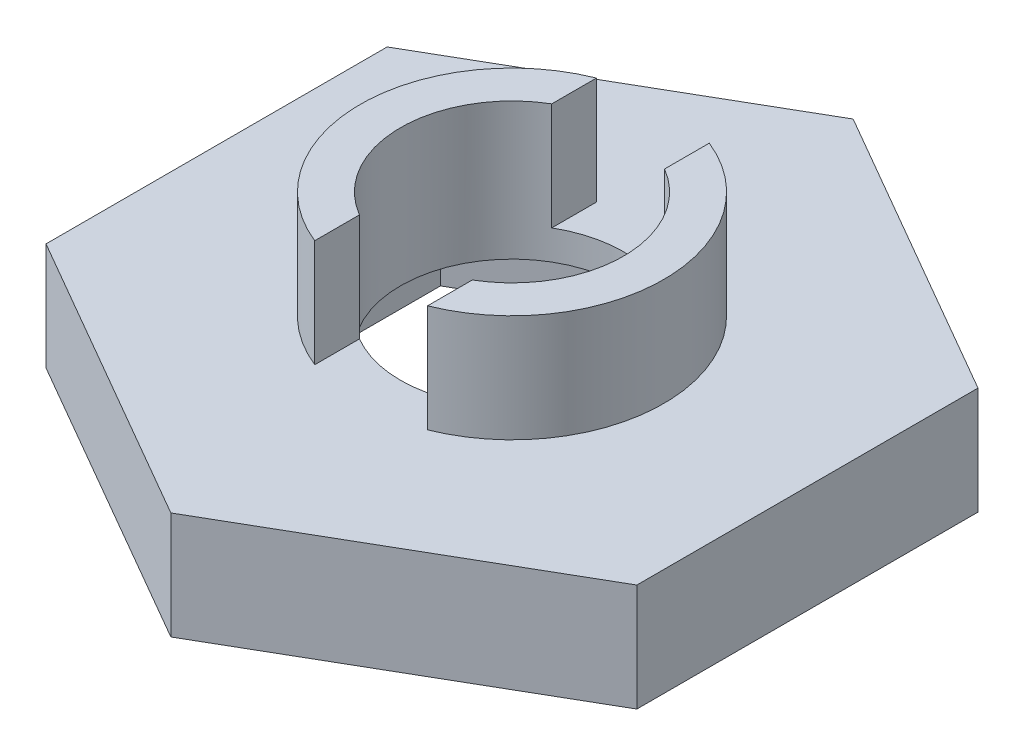
ISO-10303-21;
HEADER;
FILE_DESCRIPTION(('STEP AP214'),'2;1');
FILE_NAME('part.step','',(''),(''),'','','');
FILE_SCHEMA(('AUTOMOTIVE_DESIGN { 1 0 10303 214 1 1 1 1 }'));
ENDSEC;
DATA;
#1=APPLICATION_CONTEXT('core data for automotive mechanical design processes');
#2=APPLICATION_PROTOCOL_DEFINITION('international standard','automotive_design',2000,#1);
#3=PRODUCT_CONTEXT('',#1,'mechanical');
#4=PRODUCT('Part','Part','',(#3));
#5=PRODUCT_RELATED_PRODUCT_CATEGORY('part','',(#4));
#6=PRODUCT_DEFINITION_FORMATION('','',#4);
#7=PRODUCT_DEFINITION_CONTEXT('part definition',#1,'design');
#8=PRODUCT_DEFINITION('design','',#6,#7);
#9=PRODUCT_DEFINITION_SHAPE('','',#8);
#10=(LENGTH_UNIT() NAMED_UNIT(*) SI_UNIT(.MILLI.,.METRE.));
#11=(NAMED_UNIT(*) PLANE_ANGLE_UNIT() SI_UNIT($,.RADIAN.));
#12=(NAMED_UNIT(*) SI_UNIT($,.STERADIAN.) SOLID_ANGLE_UNIT());
#13=UNCERTAINTY_MEASURE_WITH_UNIT(LENGTH_MEASURE(1.E-05),#10,'distance_accuracy_value','');
#14=(GEOMETRIC_REPRESENTATION_CONTEXT(3) GLOBAL_UNCERTAINTY_ASSIGNED_CONTEXT((#13)) GLOBAL_UNIT_ASSIGNED_CONTEXT((#10,
#11,#12)) REPRESENTATION_CONTEXT('',''));
#15=CARTESIAN_POINT('',(0.,0.,0.));
#16=DIRECTION('',(0.,0.,1.));
#17=DIRECTION('',(1.,0.,0.));
#18=AXIS2_PLACEMENT_3D('',#15,#16,#17);
#19=CARTESIAN_POINT('',(0.,8.,0.));
#20=DIRECTION('',(0.,-1.,0.));
#21=DIRECTION('',(0.,0.,-1.));
#22=AXIS2_PLACEMENT_3D('',#19,#20,#21);
#23=CYLINDRICAL_SURFACE('',#22,5.65);
#24=CARTESIAN_POINT('',(0.,4.,0.));
#25=DIRECTION('',(0.,1.,0.));
#26=DIRECTION('',(0.,0.,1.));
#27=AXIS2_PLACEMENT_3D('',#24,#25,#26);
#28=CIRCLE('',#27,5.65);
#29=CARTESIAN_POINT('',(2.1,4.,5.24523593368306));
#30=VERTEX_POINT('',#29);
#31=CARTESIAN_POINT('',(2.1,4.,-5.24523593368306));
#32=VERTEX_POINT('',#31);
#33=EDGE_CURVE('E324',#30,#32,#28,.T.);
#34=ORIENTED_EDGE('',*,*,#33,.T.);
#35=DIRECTION('',(0.,1.,0.));
#36=VECTOR('',#35,1.);
#37=CARTESIAN_POINT('',(2.1,-0.682644071061169,-5.24523593368306));
#38=LINE('',#37,#36);
#39=CARTESIAN_POINT('',(2.1,8.,-5.24523593368306));
#40=VERTEX_POINT('',#39);
#41=EDGE_CURVE('E61',#32,#40,#38,.T.);
#42=ORIENTED_EDGE('',*,*,#41,.T.);
#43=CARTESIAN_POINT('',(0.,8.,0.));
#44=DIRECTION('',(0.,1.,0.));
#45=DIRECTION('',(0.,0.,1.));
#46=AXIS2_PLACEMENT_3D('',#43,#44,#45);
#47=CIRCLE('',#46,5.65);
#48=CARTESIAN_POINT('',(2.1,8.,5.24523593368306));
#49=VERTEX_POINT('',#48);
#50=EDGE_CURVE('E11',#49,#40,#47,.T.);
#51=ORIENTED_EDGE('',*,*,#50,.F.);
#52=DIRECTION('',(0.,1.,0.));
#53=VECTOR('',#52,1.);
#54=CARTESIAN_POINT('',(2.1,-0.682644071061169,5.24523593368306));
#55=LINE('',#54,#53);
#56=EDGE_CURVE('E270',#30,#49,#55,.T.);
#57=ORIENTED_EDGE('',*,*,#56,.F.);
#58=EDGE_LOOP('',(#34,#42,#51,#57));
#59=FACE_BOUND('',#58,.T.);
#60=ADVANCED_FACE('F37',(#59),#23,.T.);
#61=CARTESIAN_POINT('',(0.,8.,0.));
#62=DIRECTION('',(0.,1.,0.));
#63=DIRECTION('',(0.,0.,1.));
#64=AXIS2_PLACEMENT_3D('',#61,#62,#63);
#65=PLANE('',#64);
#66=DIRECTION('',(0.,0.,-1.));
#67=VECTOR('',#66,1.);
#68=CARTESIAN_POINT('',(2.1,8.,-5.24523593368306));
#69=LINE('',#68,#67);
#70=CARTESIAN_POINT('',(2.1,8.,-3.57945526581909));
#71=VERTEX_POINT('',#70);
#72=EDGE_CURVE('E246',#71,#40,#69,.T.);
#73=ORIENTED_EDGE('',*,*,#72,.F.);
#74=CARTESIAN_POINT('',(0.,8.,0.));
#75=DIRECTION('',(0.,1.,0.));
#76=DIRECTION('',(0.,0.,1.));
#77=AXIS2_PLACEMENT_3D('',#74,#75,#76);
#78=CIRCLE('',#77,4.15);
#79=CARTESIAN_POINT('',(2.1,8.,3.57945526581909));
#80=VERTEX_POINT('',#79);
#81=EDGE_CURVE('E329',#80,#71,#78,.T.);
#82=ORIENTED_EDGE('',*,*,#81,.F.);
#83=DIRECTION('',(0.,0.,-1.));
#84=VECTOR('',#83,1.);
#85=CARTESIAN_POINT('',(2.1,8.,3.57945526581909));
#86=LINE('',#85,#84);
#87=EDGE_CURVE('E265',#49,#80,#86,.T.);
#88=ORIENTED_EDGE('',*,*,#87,.F.);
#89=ORIENTED_EDGE('',*,*,#50,.T.);
#90=EDGE_LOOP('',(#73,#82,#88,#89));
#91=FACE_BOUND('',#90,.T.);
#92=ADVANCED_FACE('F357',(#91),#65,.T.);
#93=CARTESIAN_POINT('',(0.,8.,0.));
#94=DIRECTION('',(0.,-1.,0.));
#95=DIRECTION('',(0.,0.,-1.));
#96=AXIS2_PLACEMENT_3D('',#93,#94,#95);
#97=CYLINDRICAL_SURFACE('',#96,4.15);
#98=DIRECTION('',(0.,1.,0.));
#99=VECTOR('',#98,1.);
#100=CARTESIAN_POINT('',(2.1,-0.682644071061169,-3.57945526581909));
#101=LINE('',#100,#99);
#102=CARTESIAN_POINT('',(2.1,4.,-3.57945526581909));
#103=VERTEX_POINT('',#102);
#104=EDGE_CURVE('E250',#103,#71,#101,.T.);
#105=ORIENTED_EDGE('',*,*,#104,.F.);
#106=CARTESIAN_POINT('',(0.,4.,0.));
#107=DIRECTION('',(0.,1.,0.));
#108=DIRECTION('',(0.,0.,1.));
#109=AXIS2_PLACEMENT_3D('',#106,#107,#108);
#110=CIRCLE('',#109,4.15);
#111=CARTESIAN_POINT('',(-2.1,4.,-3.57945526581909));
#112=VERTEX_POINT('',#111);
#113=EDGE_CURVE('E238',#103,#112,#110,.T.);
#114=ORIENTED_EDGE('',*,*,#113,.T.);
#115=DIRECTION('',(0.,1.,0.));
#116=VECTOR('',#115,1.);
#117=CARTESIAN_POINT('',(-2.1,-0.682644071061169,-3.57945526581909));
#118=LINE('',#117,#116);
#119=CARTESIAN_POINT('',(-2.1,8.,-3.57945526581909));
#120=VERTEX_POINT('',#119);
#121=EDGE_CURVE('E252',#112,#120,#118,.T.);
#122=ORIENTED_EDGE('',*,*,#121,.T.);
#123=CARTESIAN_POINT('',(-2.1,8.,3.57945526581909));
#124=VERTEX_POINT('',#123);
#125=EDGE_CURVE('E327',#120,#124,#78,.T.);
#126=ORIENTED_EDGE('',*,*,#125,.T.);
#127=DIRECTION('',(0.,1.,0.));
#128=VECTOR('',#127,1.);
#129=CARTESIAN_POINT('',(-2.1,-0.682644071061169,3.57945526581909));
#130=LINE('',#129,#128);
#131=CARTESIAN_POINT('',(-2.1,4.,3.57945526581909));
#132=VERTEX_POINT('',#131);
#133=EDGE_CURVE('E267',#132,#124,#130,.T.);
#134=ORIENTED_EDGE('',*,*,#133,.F.);
#135=CARTESIAN_POINT('',(0.,4.,0.));
#136=DIRECTION('',(0.,1.,0.));
#137=DIRECTION('',(0.,0.,1.));
#138=AXIS2_PLACEMENT_3D('',#135,#136,#137);
#139=CIRCLE('',#138,4.15);
#140=CARTESIAN_POINT('',(2.1,4.,3.57945526581909));
#141=VERTEX_POINT('',#140);
#142=EDGE_CURVE('E260',#132,#141,#139,.T.);
#143=ORIENTED_EDGE('',*,*,#142,.T.);
#144=DIRECTION('',(0.,1.,0.));
#145=VECTOR('',#144,1.);
#146=CARTESIAN_POINT('',(2.1,-0.682644071061169,3.57945526581909));
#147=LINE('',#146,#145);
#148=EDGE_CURVE('E261',#141,#80,#147,.T.);
#149=ORIENTED_EDGE('',*,*,#148,.T.);
#150=ORIENTED_EDGE('',*,*,#81,.T.);
#151=EDGE_LOOP('',(#105,#114,#122,#126,#134,#143,#149,#150));
#152=FACE_BOUND('',#151,.T.);
#153=CARTESIAN_POINT('',(0.,2.9,0.));
#154=DIRECTION('',(0.,1.,0.));
#155=DIRECTION('',(0.,0.,1.));
#156=AXIS2_PLACEMENT_3D('',#153,#154,#155);
#157=CIRCLE('',#156,4.15);
#158=CARTESIAN_POINT('',(0.,2.9,4.15));
#159=VERTEX_POINT('',#158);
#160=EDGE_CURVE('E41',#159,#159,#157,.T.);
#161=ORIENTED_EDGE('',*,*,#160,.F.);
#162=EDGE_LOOP('',(#161));
#163=FACE_BOUND('',#162,.T.);
#164=ADVANCED_FACE('F39',(#152,#163),#97,.F.);
#165=CARTESIAN_POINT('',(-2.1,8.,-5.24523593368306));
#166=VERTEX_POINT('',#165);
#167=CARTESIAN_POINT('',(-2.1,8.,5.24523593368306));
#168=VERTEX_POINT('',#167);
#169=EDGE_CURVE('E46',#166,#168,#47,.T.);
#170=ORIENTED_EDGE('',*,*,#169,.F.);
#171=DIRECTION('',(0.,1.,0.));
#172=VECTOR('',#171,1.);
#173=CARTESIAN_POINT('',(-2.1,-0.682644071061169,-5.24523593368306));
#174=LINE('',#173,#172);
#175=CARTESIAN_POINT('',(-2.1,4.,-5.24523593368306));
#176=VERTEX_POINT('',#175);
#177=EDGE_CURVE('E248',#176,#166,#174,.T.);
#178=ORIENTED_EDGE('',*,*,#177,.F.);
#179=CARTESIAN_POINT('',(-2.1,4.,5.24523593368306));
#180=VERTEX_POINT('',#179);
#181=EDGE_CURVE('E328',#176,#180,#28,.T.);
#182=ORIENTED_EDGE('',*,*,#181,.T.);
#183=DIRECTION('',(0.,1.,0.));
#184=VECTOR('',#183,1.);
#185=CARTESIAN_POINT('',(-2.1,-0.682644071061169,5.24523593368306));
#186=LINE('',#185,#184);
#187=EDGE_CURVE('E272',#180,#168,#186,.T.);
#188=ORIENTED_EDGE('',*,*,#187,.T.);
#189=EDGE_LOOP('',(#170,#178,#182,#188));
#190=FACE_BOUND('',#189,.T.);
#191=ADVANCED_FACE('F348',(#190),#23,.T.);
#192=DIRECTION('',(0.,0.,1.));
#193=VECTOR('',#192,1.);
#194=CARTESIAN_POINT('',(-2.1,8.,-5.24523593368306));
#195=LINE('',#194,#193);
#196=EDGE_CURVE('E244',#166,#120,#195,.T.);
#197=ORIENTED_EDGE('',*,*,#196,.F.);
#198=ORIENTED_EDGE('',*,*,#169,.T.);
#199=DIRECTION('',(0.,0.,1.));
#200=VECTOR('',#199,1.);
#201=CARTESIAN_POINT('',(-2.1,8.,3.57945526581909));
#202=LINE('',#201,#200);
#203=EDGE_CURVE('E236',#124,#168,#202,.T.);
#204=ORIENTED_EDGE('',*,*,#203,.F.);
#205=ORIENTED_EDGE('',*,*,#125,.F.);
#206=EDGE_LOOP('',(#197,#198,#204,#205));
#207=FACE_BOUND('',#206,.T.);
#208=ADVANCED_FACE('F342',(#207),#65,.T.);
#209=CARTESIAN_POINT('',(0.,0.,0.));
#210=DIRECTION('',(0.,1.,0.));
#211=DIRECTION('',(0.,0.,1.));
#212=AXIS2_PLACEMENT_3D('',#209,#210,#211);
#213=PLANE('',#212);
#214=DIRECTION('',(0.,0.,1.));
#215=VECTOR('',#214,1.);
#216=CARTESIAN_POINT('',(6.3,0.,3.63730669589464));
#217=LINE('',#216,#215);
#218=CARTESIAN_POINT('',(6.3,0.,-3.63730669589464));
#219=VERTEX_POINT('',#218);
#220=CARTESIAN_POINT('',(6.3,0.,3.63730669589464));
#221=VERTEX_POINT('',#220);
#222=EDGE_CURVE('E298',#219,#221,#217,.T.);
#223=ORIENTED_EDGE('',*,*,#222,.F.);
#224=DIRECTION('',(0.866025403784439,0.,0.5));
#225=VECTOR('',#224,1.);
#226=CARTESIAN_POINT('',(6.3,0.,-3.63730669589464));
#227=LINE('',#226,#225);
#228=CARTESIAN_POINT('',(0.,0.,-7.27461339178929));
#229=VERTEX_POINT('',#228);
#230=EDGE_CURVE('E257',#229,#219,#227,.T.);
#231=ORIENTED_EDGE('',*,*,#230,.F.);
#232=DIRECTION('',(0.866025403784439,0.,-0.5));
#233=VECTOR('',#232,1.);
#234=CARTESIAN_POINT('',(0.,0.,-7.27461339178929));
#235=LINE('',#234,#233);
#236=CARTESIAN_POINT('',(-6.3,0.,-3.63730669589464));
#237=VERTEX_POINT('',#236);
#238=EDGE_CURVE('E281',#237,#229,#235,.T.);
#239=ORIENTED_EDGE('',*,*,#238,.F.);
#240=DIRECTION('',(0.,0.,-1.));
#241=VECTOR('',#240,1.);
#242=CARTESIAN_POINT('',(-6.3,0.,-3.63730669589464));
#243=LINE('',#242,#241);
#244=CARTESIAN_POINT('',(-6.3,0.,3.63730669589464));
#245=VERTEX_POINT('',#244);
#246=EDGE_CURVE('E307',#245,#237,#243,.T.);
#247=ORIENTED_EDGE('',*,*,#246,.F.);
#248=DIRECTION('',(-0.866025403784439,0.,-0.5));
#249=VECTOR('',#248,1.);
#250=CARTESIAN_POINT('',(-6.3,0.,3.63730669589464));
#251=LINE('',#250,#249);
#252=CARTESIAN_POINT('',(0.,0.,7.27461339178929));
#253=VERTEX_POINT('',#252);
#254=EDGE_CURVE('E304',#253,#245,#251,.T.);
#255=ORIENTED_EDGE('',*,*,#254,.F.);
#256=DIRECTION('',(-0.866025403784439,0.,0.5));
#257=VECTOR('',#256,1.);
#258=CARTESIAN_POINT('',(0.,0.,7.27461339178929));
#259=LINE('',#258,#257);
#260=EDGE_CURVE('E301',#221,#253,#259,.T.);
#261=ORIENTED_EDGE('',*,*,#260,.F.);
#262=EDGE_LOOP('',(#223,#231,#239,#247,#255,#261));
#263=FACE_BOUND('',#262,.T.);
#264=DIRECTION('',(0.,0.,1.));
#265=VECTOR('',#264,1.);
#266=CARTESIAN_POINT('',(11.,0.,0.));
#267=LINE('',#266,#265);
#268=CARTESIAN_POINT('',(11.,0.,-6.35085296108589));
#269=VERTEX_POINT('',#268);
#270=CARTESIAN_POINT('',(11.,0.,6.35085296108588));
#271=VERTEX_POINT('',#270);
#272=EDGE_CURVE('E177',#269,#271,#267,.T.);
#273=ORIENTED_EDGE('',*,*,#272,.T.);
#274=DIRECTION('',(-0.866025403784439,0.,0.5));
#275=VECTOR('',#274,1.);
#276=CARTESIAN_POINT('',(5.5,0.,9.52627944162882));
#277=LINE('',#276,#275);
#278=CARTESIAN_POINT('',(0.,0.,12.7017059221718));
#279=VERTEX_POINT('',#278);
#280=EDGE_CURVE('E181',#271,#279,#277,.T.);
#281=ORIENTED_EDGE('',*,*,#280,.T.);
#282=DIRECTION('',(-0.866025403784439,0.,-0.5));
#283=VECTOR('',#282,1.);
#284=CARTESIAN_POINT('',(-5.5,0.,9.52627944162883));
#285=LINE('',#284,#283);
#286=CARTESIAN_POINT('',(-11.,0.,6.35085296108588));
#287=VERTEX_POINT('',#286);
#288=EDGE_CURVE('E205',#279,#287,#285,.T.);
#289=ORIENTED_EDGE('',*,*,#288,.T.);
#290=DIRECTION('',(0.,0.,-1.));
#291=VECTOR('',#290,1.);
#292=CARTESIAN_POINT('',(-11.,0.,0.));
#293=LINE('',#292,#291);
#294=CARTESIAN_POINT('',(-11.,0.,-6.35085296108588));
#295=VERTEX_POINT('',#294);
#296=EDGE_CURVE('E210',#287,#295,#293,.T.);
#297=ORIENTED_EDGE('',*,*,#296,.T.);
#298=DIRECTION('',(0.866025403784439,0.,-0.5));
#299=VECTOR('',#298,1.);
#300=CARTESIAN_POINT('',(-5.5,0.,-9.52627944162882));
#301=LINE('',#300,#299);
#302=CARTESIAN_POINT('',(0.,0.,-12.7017059221718));
#303=VERTEX_POINT('',#302);
#304=EDGE_CURVE('E218',#295,#303,#301,.T.);
#305=ORIENTED_EDGE('',*,*,#304,.T.);
#306=DIRECTION('',(0.866025403784439,0.,0.5));
#307=VECTOR('',#306,1.);
#308=CARTESIAN_POINT('',(5.5,0.,-9.52627944162883));
#309=LINE('',#308,#307);
#310=EDGE_CURVE('E183',#303,#269,#309,.T.);
#311=ORIENTED_EDGE('',*,*,#310,.T.);
#312=EDGE_LOOP('',(#273,#281,#289,#297,#305,#311));
#313=FACE_BOUND('',#312,.T.);
#314=ADVANCED_FACE('F179',(#263,#313),#213,.F.);
#315=CARTESIAN_POINT('',(0.,4.,0.));
#316=DIRECTION('',(0.,1.,0.));
#317=DIRECTION('',(0.,0.,1.));
#318=AXIS2_PLACEMENT_3D('',#315,#316,#317);
#319=PLANE('',#318);
#320=ORIENTED_EDGE('',*,*,#33,.F.);
#321=DIRECTION('',(0.,0.,1.));
#322=VECTOR('',#321,1.);
#323=CARTESIAN_POINT('',(2.1,4.,3.57945526581909));
#324=LINE('',#323,#322);
#325=EDGE_CURVE('E258',#141,#30,#324,.T.);
#326=ORIENTED_EDGE('',*,*,#325,.F.);
#327=ORIENTED_EDGE('',*,*,#142,.F.);
#328=DIRECTION('',(0.,0.,-1.));
#329=VECTOR('',#328,1.);
#330=CARTESIAN_POINT('',(-2.1,4.,3.57945526581909));
#331=LINE('',#330,#329);
#332=EDGE_CURVE('E53',#180,#132,#331,.T.);
#333=ORIENTED_EDGE('',*,*,#332,.F.);
#334=ORIENTED_EDGE('',*,*,#181,.F.);
#335=DIRECTION('',(0.,0.,-1.));
#336=VECTOR('',#335,1.);
#337=CARTESIAN_POINT('',(-2.1,4.,-5.24523593368306));
#338=LINE('',#337,#336);
#339=EDGE_CURVE('E243',#112,#176,#338,.T.);
#340=ORIENTED_EDGE('',*,*,#339,.F.);
#341=ORIENTED_EDGE('',*,*,#113,.F.);
#342=DIRECTION('',(0.,0.,1.));
#343=VECTOR('',#342,1.);
#344=CARTESIAN_POINT('',(2.1,4.,-5.24523593368306));
#345=LINE('',#344,#343);
#346=EDGE_CURVE('E241',#32,#103,#345,.T.);
#347=ORIENTED_EDGE('',*,*,#346,.F.);
#348=EDGE_LOOP('',(#320,#326,#327,#333,#334,#340,#341,#347));
#349=FACE_BOUND('',#348,.T.);
#350=DIRECTION('',(0.866025403784439,0.,0.5));
#351=VECTOR('',#350,1.);
#352=CARTESIAN_POINT('',(5.5,4.,-9.52627944162883));
#353=LINE('',#352,#351);
#354=CARTESIAN_POINT('',(0.,4.,-12.7017059221718));
#355=VERTEX_POINT('',#354);
#356=CARTESIAN_POINT('',(11.,4.,-6.35085296108589));
#357=VERTEX_POINT('',#356);
#358=EDGE_CURVE('E187',#355,#357,#353,.T.);
#359=ORIENTED_EDGE('',*,*,#358,.F.);
#360=DIRECTION('',(0.866025403784439,0.,-0.5));
#361=VECTOR('',#360,1.);
#362=CARTESIAN_POINT('',(-5.5,4.,-9.52627944162882));
#363=LINE('',#362,#361);
#364=CARTESIAN_POINT('',(-11.,4.,-6.35085296108588));
#365=VERTEX_POINT('',#364);
#366=EDGE_CURVE('E227',#365,#355,#363,.T.);
#367=ORIENTED_EDGE('',*,*,#366,.F.);
#368=DIRECTION('',(0.,0.,-1.));
#369=VECTOR('',#368,1.);
#370=CARTESIAN_POINT('',(-11.,4.,0.));
#371=LINE('',#370,#369);
#372=CARTESIAN_POINT('',(-11.,4.,6.35085296108588));
#373=VERTEX_POINT('',#372);
#374=EDGE_CURVE('E219',#373,#365,#371,.T.);
#375=ORIENTED_EDGE('',*,*,#374,.F.);
#376=DIRECTION('',(-0.866025403784439,0.,-0.5));
#377=VECTOR('',#376,1.);
#378=CARTESIAN_POINT('',(-5.5,4.,9.52627944162883));
#379=LINE('',#378,#377);
#380=CARTESIAN_POINT('',(0.,4.,12.7017059221718));
#381=VERTEX_POINT('',#380);
#382=EDGE_CURVE('E211',#381,#373,#379,.T.);
#383=ORIENTED_EDGE('',*,*,#382,.F.);
#384=DIRECTION('',(-0.866025403784439,0.,0.5));
#385=VECTOR('',#384,1.);
#386=CARTESIAN_POINT('',(5.5,4.,9.52627944162882));
#387=LINE('',#386,#385);
#388=CARTESIAN_POINT('',(11.,4.,6.35085296108588));
#389=VERTEX_POINT('',#388);
#390=EDGE_CURVE('E197',#389,#381,#387,.T.);
#391=ORIENTED_EDGE('',*,*,#390,.F.);
#392=DIRECTION('',(0.,0.,1.));
#393=VECTOR('',#392,1.);
#394=CARTESIAN_POINT('',(11.,4.,0.));
#395=LINE('',#394,#393);
#396=EDGE_CURVE('E200',#357,#389,#395,.T.);
#397=ORIENTED_EDGE('',*,*,#396,.F.);
#398=EDGE_LOOP('',(#359,#367,#375,#383,#391,#397));
#399=FACE_BOUND('',#398,.T.);
#400=ADVANCED_FACE('F370',(#349,#399),#319,.T.);
#401=CARTESIAN_POINT('',(6.3,2.9,-3.63730669589464));
#402=DIRECTION('',(0.5,0.,-0.866025403784439));
#403=DIRECTION('',(-0.866025403784439,0.,-0.5));
#404=AXIS2_PLACEMENT_3D('',#401,#402,#403);
#405=PLANE('',#404);
#406=ORIENTED_EDGE('',*,*,#230,.T.);
#407=DIRECTION('',(0.,-1.,0.));
#408=VECTOR('',#407,1.);
#409=CARTESIAN_POINT('',(6.3,2.9,-3.63730669589464));
#410=LINE('',#409,#408);
#411=CARTESIAN_POINT('',(6.3,2.9,-3.63730669589464));
#412=VERTEX_POINT('',#411);
#413=EDGE_CURVE('E296',#412,#219,#410,.T.);
#414=ORIENTED_EDGE('',*,*,#413,.F.);
#415=DIRECTION('',(0.866025403784439,0.,0.5));
#416=VECTOR('',#415,1.);
#417=CARTESIAN_POINT('',(6.3,2.9,-3.63730669589464));
#418=LINE('',#417,#416);
#419=CARTESIAN_POINT('',(0.,2.9,-7.27461339178929));
#420=VERTEX_POINT('',#419);
#421=EDGE_CURVE('E277',#420,#412,#418,.T.);
#422=ORIENTED_EDGE('',*,*,#421,.F.);
#423=DIRECTION('',(0.,-1.,0.));
#424=VECTOR('',#423,1.);
#425=CARTESIAN_POINT('',(0.,2.9,-7.27461339178929));
#426=LINE('',#425,#424);
#427=EDGE_CURVE('E312',#420,#229,#426,.T.);
#428=ORIENTED_EDGE('',*,*,#427,.T.);
#429=EDGE_LOOP('',(#406,#414,#422,#428));
#430=FACE_BOUND('',#429,.T.);
#431=ADVANCED_FACE('F376',(#430),#405,.F.);
#432=CARTESIAN_POINT('',(0.,2.9,-7.27461339178929));
#433=DIRECTION('',(-0.5,0.,-0.866025403784439));
#434=DIRECTION('',(-0.866025403784439,0.,0.5));
#435=AXIS2_PLACEMENT_3D('',#432,#433,#434);
#436=PLANE('',#435);
#437=ORIENTED_EDGE('',*,*,#238,.T.);
#438=ORIENTED_EDGE('',*,*,#427,.F.);
#439=DIRECTION('',(0.866025403784439,0.,-0.5));
#440=VECTOR('',#439,1.);
#441=CARTESIAN_POINT('',(0.,2.9,-7.27461339178929));
#442=LINE('',#441,#440);
#443=CARTESIAN_POINT('',(-6.3,2.9,-3.63730669589464));
#444=VERTEX_POINT('',#443);
#445=EDGE_CURVE('E293',#444,#420,#442,.T.);
#446=ORIENTED_EDGE('',*,*,#445,.F.);
#447=DIRECTION('',(0.,-1.,0.));
#448=VECTOR('',#447,1.);
#449=CARTESIAN_POINT('',(-6.3,2.9,-3.63730669589464));
#450=LINE('',#449,#448);
#451=EDGE_CURVE('E314',#444,#237,#450,.T.);
#452=ORIENTED_EDGE('',*,*,#451,.T.);
#453=EDGE_LOOP('',(#437,#438,#446,#452));
#454=FACE_BOUND('',#453,.T.);
#455=ADVANCED_FACE('F379',(#454),#436,.F.);
#456=CARTESIAN_POINT('',(-6.3,2.9,-3.63730669589464));
#457=DIRECTION('',(-1.,0.,0.));
#458=DIRECTION('',(0.,0.,1.));
#459=AXIS2_PLACEMENT_3D('',#456,#457,#458);
#460=PLANE('',#459);
#461=ORIENTED_EDGE('',*,*,#246,.T.);
#462=ORIENTED_EDGE('',*,*,#451,.F.);
#463=DIRECTION('',(0.,0.,-1.));
#464=VECTOR('',#463,1.);
#465=CARTESIAN_POINT('',(-6.3,2.9,-3.63730669589464));
#466=LINE('',#465,#464);
#467=CARTESIAN_POINT('',(-6.3,2.9,3.63730669589464));
#468=VERTEX_POINT('',#467);
#469=EDGE_CURVE('E290',#468,#444,#466,.T.);
#470=ORIENTED_EDGE('',*,*,#469,.F.);
#471=DIRECTION('',(0.,-1.,0.));
#472=VECTOR('',#471,1.);
#473=CARTESIAN_POINT('',(-6.3,2.9,3.63730669589464));
#474=LINE('',#473,#472);
#475=EDGE_CURVE('E316',#468,#245,#474,.T.);
#476=ORIENTED_EDGE('',*,*,#475,.T.);
#477=EDGE_LOOP('',(#461,#462,#470,#476));
#478=FACE_BOUND('',#477,.T.);
#479=ADVANCED_FACE('F392',(#478),#460,.F.);
#480=CARTESIAN_POINT('',(-6.3,2.9,3.63730669589464));
#481=DIRECTION('',(-0.5,0.,0.866025403784439));
#482=DIRECTION('',(0.866025403784439,0.,0.5));
#483=AXIS2_PLACEMENT_3D('',#480,#481,#482);
#484=PLANE('',#483);
#485=ORIENTED_EDGE('',*,*,#254,.T.);
#486=ORIENTED_EDGE('',*,*,#475,.F.);
#487=DIRECTION('',(-0.866025403784439,0.,-0.5));
#488=VECTOR('',#487,1.);
#489=CARTESIAN_POINT('',(-6.3,2.9,3.63730669589464));
#490=LINE('',#489,#488);
#491=CARTESIAN_POINT('',(0.,2.9,7.27461339178929));
#492=VERTEX_POINT('',#491);
#493=EDGE_CURVE('E287',#492,#468,#490,.T.);
#494=ORIENTED_EDGE('',*,*,#493,.F.);
#495=DIRECTION('',(0.,-1.,0.));
#496=VECTOR('',#495,1.);
#497=CARTESIAN_POINT('',(0.,2.9,7.27461339178929));
#498=LINE('',#497,#496);
#499=EDGE_CURVE('E318',#492,#253,#498,.T.);
#500=ORIENTED_EDGE('',*,*,#499,.T.);
#501=EDGE_LOOP('',(#485,#486,#494,#500));
#502=FACE_BOUND('',#501,.T.);
#503=ADVANCED_FACE('F388',(#502),#484,.F.);
#504=CARTESIAN_POINT('',(0.,2.9,7.27461339178929));
#505=DIRECTION('',(0.5,0.,0.866025403784439));
#506=DIRECTION('',(0.866025403784439,0.,-0.5));
#507=AXIS2_PLACEMENT_3D('',#504,#505,#506);
#508=PLANE('',#507);
#509=ORIENTED_EDGE('',*,*,#260,.T.);
#510=ORIENTED_EDGE('',*,*,#499,.F.);
#511=DIRECTION('',(-0.866025403784439,0.,0.5));
#512=VECTOR('',#511,1.);
#513=CARTESIAN_POINT('',(0.,2.9,7.27461339178929));
#514=LINE('',#513,#512);
#515=CARTESIAN_POINT('',(6.3,2.9,3.63730669589464));
#516=VERTEX_POINT('',#515);
#517=EDGE_CURVE('E284',#516,#492,#514,.T.);
#518=ORIENTED_EDGE('',*,*,#517,.F.);
#519=DIRECTION('',(0.,-1.,0.));
#520=VECTOR('',#519,1.);
#521=CARTESIAN_POINT('',(6.3,2.9,3.63730669589464));
#522=LINE('',#521,#520);
#523=EDGE_CURVE('E320',#516,#221,#522,.T.);
#524=ORIENTED_EDGE('',*,*,#523,.T.);
#525=EDGE_LOOP('',(#509,#510,#518,#524));
#526=FACE_BOUND('',#525,.T.);
#527=ADVANCED_FACE('F384',(#526),#508,.F.);
#528=CARTESIAN_POINT('',(6.3,2.9,3.63730669589464));
#529=DIRECTION('',(1.,0.,0.));
#530=DIRECTION('',(0.,0.,-1.));
#531=AXIS2_PLACEMENT_3D('',#528,#529,#530);
#532=PLANE('',#531);
#533=ORIENTED_EDGE('',*,*,#222,.T.);
#534=ORIENTED_EDGE('',*,*,#523,.F.);
#535=DIRECTION('',(0.,0.,1.));
#536=VECTOR('',#535,1.);
#537=CARTESIAN_POINT('',(6.3,2.9,3.63730669589464));
#538=LINE('',#537,#536);
#539=EDGE_CURVE('E280',#412,#516,#538,.T.);
#540=ORIENTED_EDGE('',*,*,#539,.F.);
#541=ORIENTED_EDGE('',*,*,#413,.T.);
#542=EDGE_LOOP('',(#533,#534,#540,#541));
#543=FACE_BOUND('',#542,.T.);
#544=ADVANCED_FACE('F381',(#543),#532,.F.);
#545=CARTESIAN_POINT('',(0.,2.9,0.));
#546=DIRECTION('',(0.,1.,0.));
#547=DIRECTION('',(0.,0.,1.));
#548=AXIS2_PLACEMENT_3D('',#545,#546,#547);
#549=PLANE('',#548);
#550=ORIENTED_EDGE('',*,*,#160,.T.);
#551=EDGE_LOOP('',(#550));
#552=FACE_BOUND('',#551,.T.);
#553=ORIENTED_EDGE('',*,*,#421,.T.);
#554=ORIENTED_EDGE('',*,*,#539,.T.);
#555=ORIENTED_EDGE('',*,*,#517,.T.);
#556=ORIENTED_EDGE('',*,*,#493,.T.);
#557=ORIENTED_EDGE('',*,*,#469,.T.);
#558=ORIENTED_EDGE('',*,*,#445,.T.);
#559=EDGE_LOOP('',(#553,#554,#555,#556,#557,#558));
#560=FACE_BOUND('',#559,.T.);
#561=ADVANCED_FACE('F354',(#552,#560),#549,.F.);
#562=CARTESIAN_POINT('',(2.1,-0.682644071061169,3.57945526581909));
#563=DIRECTION('',(1.,0.,0.));
#564=DIRECTION('',(0.,0.,-1.));
#565=AXIS2_PLACEMENT_3D('',#562,#563,#564);
#566=PLANE('',#565);
#567=ORIENTED_EDGE('',*,*,#325,.T.);
#568=ORIENTED_EDGE('',*,*,#56,.T.);
#569=ORIENTED_EDGE('',*,*,#87,.T.);
#570=ORIENTED_EDGE('',*,*,#148,.F.);
#571=EDGE_LOOP('',(#567,#568,#569,#570));
#572=FACE_BOUND('',#571,.T.);
#573=ADVANCED_FACE('F402',(#572),#566,.F.);
#574=CARTESIAN_POINT('',(-2.1,-0.682644071061169,3.57945526581909));
#575=DIRECTION('',(-1.,0.,0.));
#576=DIRECTION('',(0.,0.,1.));
#577=AXIS2_PLACEMENT_3D('',#574,#575,#576);
#578=PLANE('',#577);
#579=ORIENTED_EDGE('',*,*,#332,.T.);
#580=ORIENTED_EDGE('',*,*,#133,.T.);
#581=ORIENTED_EDGE('',*,*,#203,.T.);
#582=ORIENTED_EDGE('',*,*,#187,.F.);
#583=EDGE_LOOP('',(#579,#580,#581,#582));
#584=FACE_BOUND('',#583,.T.);
#585=ADVANCED_FACE('F345',(#584),#578,.F.);
#586=CARTESIAN_POINT('',(2.1,-0.682644071061169,-5.24523593368306));
#587=DIRECTION('',(1.,0.,0.));
#588=DIRECTION('',(0.,0.,-1.));
#589=AXIS2_PLACEMENT_3D('',#586,#587,#588);
#590=PLANE('',#589);
#591=ORIENTED_EDGE('',*,*,#346,.T.);
#592=ORIENTED_EDGE('',*,*,#104,.T.);
#593=ORIENTED_EDGE('',*,*,#72,.T.);
#594=ORIENTED_EDGE('',*,*,#41,.F.);
#595=EDGE_LOOP('',(#591,#592,#593,#594));
#596=FACE_BOUND('',#595,.T.);
#597=ADVANCED_FACE('F405',(#596),#590,.F.);
#598=CARTESIAN_POINT('',(-2.1,-0.682644071061169,-5.24523593368306));
#599=DIRECTION('',(-1.,0.,0.));
#600=DIRECTION('',(0.,0.,1.));
#601=AXIS2_PLACEMENT_3D('',#598,#599,#600);
#602=PLANE('',#601);
#603=ORIENTED_EDGE('',*,*,#339,.T.);
#604=ORIENTED_EDGE('',*,*,#177,.T.);
#605=ORIENTED_EDGE('',*,*,#196,.T.);
#606=ORIENTED_EDGE('',*,*,#121,.F.);
#607=EDGE_LOOP('',(#603,#604,#605,#606));
#608=FACE_BOUND('',#607,.T.);
#609=ADVANCED_FACE('F409',(#608),#602,.F.);
#610=CARTESIAN_POINT('',(5.5,15.4491629970637,-9.52627944162883));
#611=DIRECTION('',(0.5,0.,-0.866025403784439));
#612=DIRECTION('',(-0.866025403784439,0.,-0.5));
#613=AXIS2_PLACEMENT_3D('',#610,#611,#612);
#614=PLANE('',#613);
#615=ORIENTED_EDGE('',*,*,#310,.F.);
#616=DIRECTION('',(0.,-1.,0.));
#617=VECTOR('',#616,1.);
#618=CARTESIAN_POINT('',(0.,15.4491629970637,-12.7017059221718));
#619=LINE('',#618,#617);
#620=EDGE_CURVE('E224',#355,#303,#619,.T.);
#621=ORIENTED_EDGE('',*,*,#620,.F.);
#622=ORIENTED_EDGE('',*,*,#358,.T.);
#623=DIRECTION('',(0.,-1.,0.));
#624=VECTOR('',#623,1.);
#625=CARTESIAN_POINT('',(11.,15.4491629970637,-6.35085296108589));
#626=LINE('',#625,#624);
#627=EDGE_CURVE('E234',#357,#269,#626,.T.);
#628=ORIENTED_EDGE('',*,*,#627,.T.);
#629=EDGE_LOOP('',(#615,#621,#622,#628));
#630=FACE_BOUND('',#629,.T.);
#631=ADVANCED_FACE('F412',(#630),#614,.T.);
#632=CARTESIAN_POINT('',(11.,15.4491629970637,0.));
#633=DIRECTION('',(1.,0.,0.));
#634=DIRECTION('',(0.,0.,-1.));
#635=AXIS2_PLACEMENT_3D('',#632,#633,#634);
#636=PLANE('',#635);
#637=ORIENTED_EDGE('',*,*,#627,.F.);
#638=ORIENTED_EDGE('',*,*,#396,.T.);
#639=DIRECTION('',(0.,-1.,0.));
#640=VECTOR('',#639,1.);
#641=CARTESIAN_POINT('',(11.,15.4491629970637,6.35085296108588));
#642=LINE('',#641,#640);
#643=EDGE_CURVE('E194',#389,#271,#642,.T.);
#644=ORIENTED_EDGE('',*,*,#643,.T.);
#645=ORIENTED_EDGE('',*,*,#272,.F.);
#646=EDGE_LOOP('',(#637,#638,#644,#645));
#647=FACE_BOUND('',#646,.T.);
#648=ADVANCED_FACE('F199',(#647),#636,.T.);
#649=CARTESIAN_POINT('',(-5.5,15.4491629970637,-9.52627944162882));
#650=DIRECTION('',(-0.5,0.,-0.866025403784439));
#651=DIRECTION('',(-0.866025403784439,0.,0.5));
#652=AXIS2_PLACEMENT_3D('',#649,#650,#651);
#653=PLANE('',#652);
#654=ORIENTED_EDGE('',*,*,#304,.F.);
#655=DIRECTION('',(0.,-1.,0.));
#656=VECTOR('',#655,1.);
#657=CARTESIAN_POINT('',(-11.,15.4491629970637,-6.35085296108588));
#658=LINE('',#657,#656);
#659=EDGE_CURVE('E215',#365,#295,#658,.T.);
#660=ORIENTED_EDGE('',*,*,#659,.F.);
#661=ORIENTED_EDGE('',*,*,#366,.T.);
#662=ORIENTED_EDGE('',*,*,#620,.T.);
#663=EDGE_LOOP('',(#654,#660,#661,#662));
#664=FACE_BOUND('',#663,.T.);
#665=ADVANCED_FACE('F421',(#664),#653,.T.);
#666=CARTESIAN_POINT('',(-11.,15.4491629970637,0.));
#667=DIRECTION('',(-1.,0.,0.));
#668=DIRECTION('',(0.,0.,1.));
#669=AXIS2_PLACEMENT_3D('',#666,#667,#668);
#670=PLANE('',#669);
#671=ORIENTED_EDGE('',*,*,#296,.F.);
#672=DIRECTION('',(0.,-1.,0.));
#673=VECTOR('',#672,1.);
#674=CARTESIAN_POINT('',(-11.,15.4491629970637,6.35085296108588));
#675=LINE('',#674,#673);
#676=EDGE_CURVE('E207',#373,#287,#675,.T.);
#677=ORIENTED_EDGE('',*,*,#676,.F.);
#678=ORIENTED_EDGE('',*,*,#374,.T.);
#679=ORIENTED_EDGE('',*,*,#659,.T.);
#680=EDGE_LOOP('',(#671,#677,#678,#679));
#681=FACE_BOUND('',#680,.T.);
#682=ADVANCED_FACE('F424',(#681),#670,.T.);
#683=CARTESIAN_POINT('',(-5.5,15.4491629970637,9.52627944162883));
#684=DIRECTION('',(-0.5,0.,0.866025403784439));
#685=DIRECTION('',(0.866025403784439,0.,0.5));
#686=AXIS2_PLACEMENT_3D('',#683,#684,#685);
#687=PLANE('',#686);
#688=ORIENTED_EDGE('',*,*,#288,.F.);
#689=DIRECTION('',(0.,-1.,0.));
#690=VECTOR('',#689,1.);
#691=CARTESIAN_POINT('',(0.,15.4491629970637,12.7017059221718));
#692=LINE('',#691,#690);
#693=EDGE_CURVE('E196',#381,#279,#692,.T.);
#694=ORIENTED_EDGE('',*,*,#693,.F.);
#695=ORIENTED_EDGE('',*,*,#382,.T.);
#696=ORIENTED_EDGE('',*,*,#676,.T.);
#697=EDGE_LOOP('',(#688,#694,#695,#696));
#698=FACE_BOUND('',#697,.T.);
#699=ADVANCED_FACE('F428',(#698),#687,.T.);
#700=CARTESIAN_POINT('',(5.5,15.4491629970637,9.52627944162882));
#701=DIRECTION('',(0.5,0.,0.866025403784439));
#702=DIRECTION('',(0.866025403784439,0.,-0.5));
#703=AXIS2_PLACEMENT_3D('',#700,#701,#702);
#704=PLANE('',#703);
#705=ORIENTED_EDGE('',*,*,#280,.F.);
#706=ORIENTED_EDGE('',*,*,#643,.F.);
#707=ORIENTED_EDGE('',*,*,#390,.T.);
#708=ORIENTED_EDGE('',*,*,#693,.T.);
#709=EDGE_LOOP('',(#705,#706,#707,#708));
#710=FACE_BOUND('',#709,.T.);
#711=ADVANCED_FACE('F192',(#710),#704,.T.);
#712=CLOSED_SHELL('',(#60,#92,#164,#191,#208,#314,#400,#431,#455,#479,#503,#527,#544,#561,#573,
#585,#597,#609,#631,#648,#665,#682,#699,#711));
#713=MANIFOLD_SOLID_BREP('B2',#712);
#714=ADVANCED_BREP_SHAPE_REPRESENTATION('',(#18,#713),#14);
#715=SHAPE_DEFINITION_REPRESENTATION(#9,#714);
ENDSEC;
END-ISO-10303-21;
